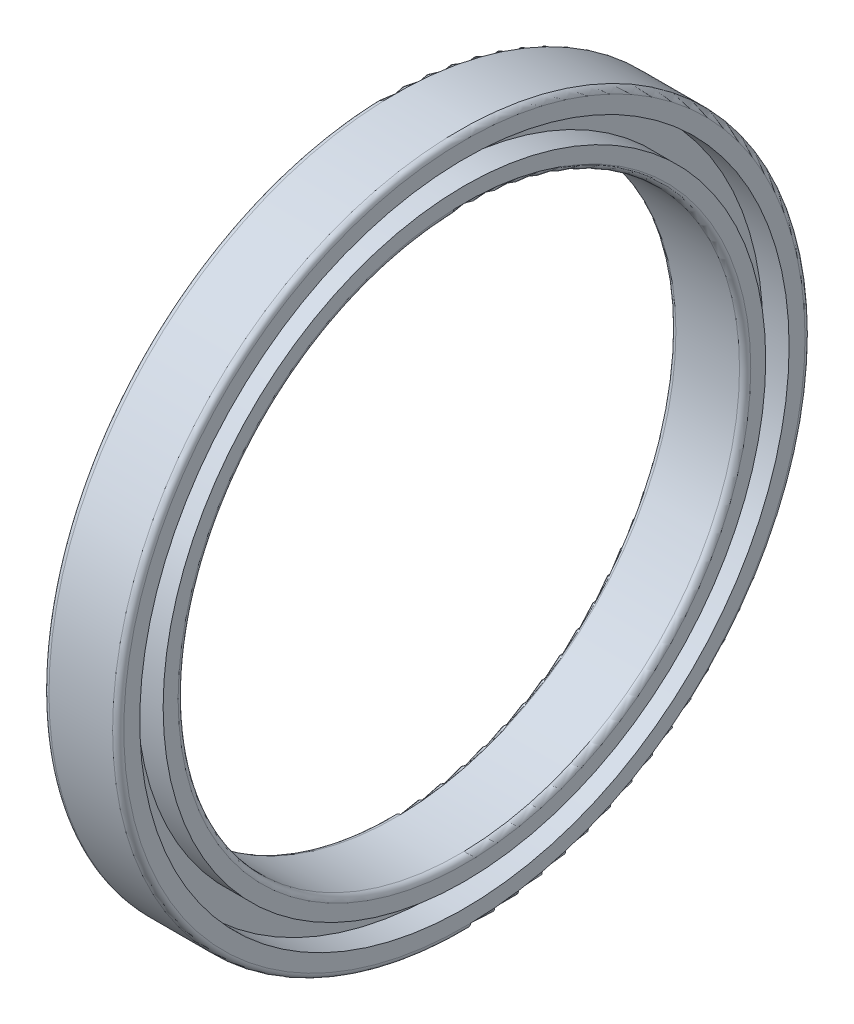
ISO-10303-21;
HEADER;
FILE_DESCRIPTION(('STEP AP214'),'2;1');
FILE_NAME('part.step','',(''),(''),'','','');
FILE_SCHEMA(('AUTOMOTIVE_DESIGN { 1 0 10303 214 1 1 1 1 }'));
ENDSEC;
DATA;
#1=APPLICATION_CONTEXT('core data for automotive mechanical design processes');
#2=APPLICATION_PROTOCOL_DEFINITION('international standard','automotive_design',2000,#1);
#3=PRODUCT_CONTEXT('',#1,'mechanical');
#4=PRODUCT('Part','Part','',(#3));
#5=PRODUCT_RELATED_PRODUCT_CATEGORY('part','',(#4));
#6=PRODUCT_DEFINITION_FORMATION('','',#4);
#7=PRODUCT_DEFINITION_CONTEXT('part definition',#1,'design');
#8=PRODUCT_DEFINITION('design','',#6,#7);
#9=PRODUCT_DEFINITION_SHAPE('','',#8);
#10=(LENGTH_UNIT() NAMED_UNIT(*) SI_UNIT(.MILLI.,.METRE.));
#11=(NAMED_UNIT(*) PLANE_ANGLE_UNIT() SI_UNIT($,.RADIAN.));
#12=(NAMED_UNIT(*) SI_UNIT($,.STERADIAN.) SOLID_ANGLE_UNIT());
#13=UNCERTAINTY_MEASURE_WITH_UNIT(LENGTH_MEASURE(1.E-05),#10,'distance_accuracy_value','');
#14=(GEOMETRIC_REPRESENTATION_CONTEXT(3) GLOBAL_UNCERTAINTY_ASSIGNED_CONTEXT((#13)) GLOBAL_UNIT_ASSIGNED_CONTEXT((#10,
#11,#12)) REPRESENTATION_CONTEXT('',''));
#15=CARTESIAN_POINT('',(0.,0.,0.));
#16=DIRECTION('',(0.,0.,1.));
#17=DIRECTION('',(1.,0.,0.));
#18=AXIS2_PLACEMENT_3D('',#15,#16,#17);
#19=CARTESIAN_POINT('',(-1.7,0.,0.));
#20=DIRECTION('',(1.,0.,0.));
#21=DIRECTION('',(0.,0.,-1.));
#22=AXIS2_PLACEMENT_3D('',#19,#20,#21);
#23=TOROIDAL_SURFACE('',#22,18.2,0.3);
#24=CARTESIAN_POINT('',(-2.,0.,0.));
#25=DIRECTION('',(1.,0.,0.));
#26=DIRECTION('',(0.,0.,-1.));
#27=AXIS2_PLACEMENT_3D('',#24,#25,#26);
#28=CIRCLE('',#27,18.2);
#29=CARTESIAN_POINT('',(-2.,0.,-18.2));
#30=VERTEX_POINT('',#29);
#31=EDGE_CURVE('E10',#30,#30,#28,.T.);
#32=ORIENTED_EDGE('',*,*,#31,.T.);
#33=EDGE_LOOP('',(#32));
#34=FACE_BOUND('',#33,.T.);
#35=CARTESIAN_POINT('',(-1.7,0.,0.));
#36=DIRECTION('',(1.,0.,0.));
#37=DIRECTION('',(0.,0.,-1.));
#38=AXIS2_PLACEMENT_3D('',#35,#36,#37);
#39=CIRCLE('',#38,18.5);
#40=CARTESIAN_POINT('',(-1.7,0.,-18.5));
#41=VERTEX_POINT('',#40);
#42=EDGE_CURVE('E266',#41,#41,#39,.T.);
#43=ORIENTED_EDGE('',*,*,#42,.F.);
#44=EDGE_LOOP('',(#43));
#45=FACE_BOUND('',#44,.T.);
#46=ADVANCED_FACE('F16',(#34,#45),#23,.T.);
#47=CARTESIAN_POINT('',(-2.,17.35,0.));
#48=DIRECTION('',(1.,0.,0.));
#49=DIRECTION('',(0.,1.,0.));
#50=AXIS2_PLACEMENT_3D('',#47,#48,#49);
#51=PLANE('',#50);
#52=CARTESIAN_POINT('',(-2.,0.,0.));
#53=DIRECTION('',(1.,0.,0.));
#54=DIRECTION('',(0.,0.,-1.));
#55=AXIS2_PLACEMENT_3D('',#52,#53,#54);
#56=CIRCLE('',#55,17.35);
#57=CARTESIAN_POINT('',(-2.,0.,-17.35));
#58=VERTEX_POINT('',#57);
#59=EDGE_CURVE('E24',#58,#58,#56,.T.);
#60=ORIENTED_EDGE('',*,*,#59,.T.);
#61=EDGE_LOOP('',(#60));
#62=FACE_BOUND('',#61,.T.);
#63=ORIENTED_EDGE('',*,*,#31,.F.);
#64=EDGE_LOOP('',(#63));
#65=FACE_BOUND('',#64,.T.);
#66=ADVANCED_FACE('F90',(#62,#65),#51,.F.);
#67=CARTESIAN_POINT('',(2.,0.,0.));
#68=DIRECTION('',(-1.,0.,0.));
#69=DIRECTION('',(0.,0.,-1.));
#70=AXIS2_PLACEMENT_3D('',#67,#68,#69);
#71=CYLINDRICAL_SURFACE('',#70,17.35);
#72=ORIENTED_EDGE('',*,*,#59,.F.);
#73=EDGE_LOOP('',(#72));
#74=FACE_BOUND('',#73,.T.);
#75=CARTESIAN_POINT('',(-0.6,0.,0.));
#76=DIRECTION('',(1.,0.,0.));
#77=DIRECTION('',(0.,0.,-1.));
#78=AXIS2_PLACEMENT_3D('',#75,#76,#77);
#79=CIRCLE('',#78,17.35);
#80=CARTESIAN_POINT('',(-0.6,0.,-17.35));
#81=VERTEX_POINT('',#80);
#82=EDGE_CURVE('E73',#81,#81,#79,.T.);
#83=ORIENTED_EDGE('',*,*,#82,.T.);
#84=EDGE_LOOP('',(#83));
#85=FACE_BOUND('',#84,.T.);
#86=ADVANCED_FACE('F95',(#74,#85),#71,.F.);
#87=CARTESIAN_POINT('',(-0.6,16.1,0.));
#88=DIRECTION('',(1.,0.,0.));
#89=DIRECTION('',(0.,1.,0.));
#90=AXIS2_PLACEMENT_3D('',#87,#88,#89);
#91=PLANE('',#90);
#92=CARTESIAN_POINT('',(-0.6,0.,0.));
#93=DIRECTION('',(1.,0.,0.));
#94=DIRECTION('',(0.,0.,-1.));
#95=AXIS2_PLACEMENT_3D('',#92,#93,#94);
#96=CIRCLE('',#95,16.1);
#97=CARTESIAN_POINT('',(-0.6,0.,-16.1));
#98=VERTEX_POINT('',#97);
#99=EDGE_CURVE('E80',#98,#98,#96,.T.);
#100=ORIENTED_EDGE('',*,*,#99,.T.);
#101=EDGE_LOOP('',(#100));
#102=FACE_BOUND('',#101,.T.);
#103=ORIENTED_EDGE('',*,*,#82,.F.);
#104=EDGE_LOOP('',(#103));
#105=FACE_BOUND('',#104,.T.);
#106=ADVANCED_FACE('F188',(#102,#105),#91,.F.);
#107=CARTESIAN_POINT('',(1.7,0.,0.));
#108=DIRECTION('',(1.,0.,0.));
#109=DIRECTION('',(0.,0.,-1.));
#110=AXIS2_PLACEMENT_3D('',#107,#108,#109);
#111=TOROIDAL_SURFACE('',#110,15.3,0.3);
#112=CARTESIAN_POINT('',(2.,0.,0.));
#113=DIRECTION('',(1.,0.,0.));
#114=DIRECTION('',(0.,0.,-1.));
#115=AXIS2_PLACEMENT_3D('',#112,#113,#114);
#116=CIRCLE('',#115,15.3);
#117=CARTESIAN_POINT('',(2.,0.,-15.3));
#118=VERTEX_POINT('',#117);
#119=EDGE_CURVE('E291',#118,#118,#116,.T.);
#120=ORIENTED_EDGE('',*,*,#119,.T.);
#121=EDGE_LOOP('',(#120));
#122=FACE_BOUND('',#121,.T.);
#123=CARTESIAN_POINT('',(1.7,0.,0.));
#124=DIRECTION('',(1.,0.,0.));
#125=DIRECTION('',(0.,0.,-1.));
#126=AXIS2_PLACEMENT_3D('',#123,#124,#125);
#127=CIRCLE('',#126,15.);
#128=CARTESIAN_POINT('',(1.7,0.,-15.));
#129=VERTEX_POINT('',#128);
#130=EDGE_CURVE('E68',#129,#129,#127,.T.);
#131=ORIENTED_EDGE('',*,*,#130,.F.);
#132=EDGE_LOOP('',(#131));
#133=FACE_BOUND('',#132,.T.);
#134=ADVANCED_FACE('F202',(#122,#133),#111,.T.);
#135=CARTESIAN_POINT('',(50.,0.,0.));
#136=DIRECTION('',(-1.,0.,0.));
#137=DIRECTION('',(0.,0.,-1.));
#138=AXIS2_PLACEMENT_3D('',#135,#136,#137);
#139=CYLINDRICAL_SURFACE('',#138,15.);
#140=ORIENTED_EDGE('',*,*,#130,.T.);
#141=EDGE_LOOP('',(#140));
#142=FACE_BOUND('',#141,.T.);
#143=CARTESIAN_POINT('',(-1.7,0.,0.));
#144=DIRECTION('',(1.,0.,0.));
#145=DIRECTION('',(0.,0.,-1.));
#146=AXIS2_PLACEMENT_3D('',#143,#144,#145);
#147=CIRCLE('',#146,15.);
#148=CARTESIAN_POINT('',(-1.7,0.,-15.));
#149=VERTEX_POINT('',#148);
#150=EDGE_CURVE('E74',#149,#149,#147,.T.);
#151=ORIENTED_EDGE('',*,*,#150,.F.);
#152=EDGE_LOOP('',(#151));
#153=FACE_BOUND('',#152,.T.);
#154=ADVANCED_FACE('F69',(#142,#153),#139,.F.);
#155=CARTESIAN_POINT('',(-1.7,0.,0.));
#156=DIRECTION('',(1.,0.,0.));
#157=DIRECTION('',(0.,0.,-1.));
#158=AXIS2_PLACEMENT_3D('',#155,#156,#157);
#159=TOROIDAL_SURFACE('',#158,15.3,0.3);
#160=ORIENTED_EDGE('',*,*,#150,.T.);
#161=EDGE_LOOP('',(#160));
#162=FACE_BOUND('',#161,.T.);
#163=CARTESIAN_POINT('',(-2.,0.,0.));
#164=DIRECTION('',(1.,0.,0.));
#165=DIRECTION('',(0.,0.,-1.));
#166=AXIS2_PLACEMENT_3D('',#163,#164,#165);
#167=CIRCLE('',#166,15.3);
#168=CARTESIAN_POINT('',(-2.,0.,-15.3));
#169=VERTEX_POINT('',#168);
#170=EDGE_CURVE('E275',#169,#169,#167,.T.);
#171=ORIENTED_EDGE('',*,*,#170,.F.);
#172=EDGE_LOOP('',(#171));
#173=FACE_BOUND('',#172,.T.);
#174=ADVANCED_FACE('F179',(#162,#173),#159,.T.);
#175=CARTESIAN_POINT('',(2.,0.,0.));
#176=DIRECTION('',(-1.,0.,0.));
#177=DIRECTION('',(0.,0.,-1.));
#178=AXIS2_PLACEMENT_3D('',#175,#176,#177);
#179=CYLINDRICAL_SURFACE('',#178,16.1);
#180=ORIENTED_EDGE('',*,*,#99,.F.);
#181=EDGE_LOOP('',(#180));
#182=FACE_BOUND('',#181,.T.);
#183=CARTESIAN_POINT('',(-2.,0.,0.));
#184=DIRECTION('',(1.,0.,0.));
#185=DIRECTION('',(0.,0.,-1.));
#186=AXIS2_PLACEMENT_3D('',#183,#184,#185);
#187=CIRCLE('',#186,16.1);
#188=CARTESIAN_POINT('',(-2.,0.,-16.1));
#189=VERTEX_POINT('',#188);
#190=EDGE_CURVE('E269',#189,#189,#187,.T.);
#191=ORIENTED_EDGE('',*,*,#190,.T.);
#192=EDGE_LOOP('',(#191));
#193=FACE_BOUND('',#192,.T.);
#194=ADVANCED_FACE('F170',(#182,#193),#179,.T.);
#195=CARTESIAN_POINT('',(-2.,0.,0.));
#196=DIRECTION('',(1.,0.,0.));
#197=DIRECTION('',(0.,1.,0.));
#198=AXIS2_PLACEMENT_3D('',#195,#196,#197);
#199=PLANE('',#198);
#200=ORIENTED_EDGE('',*,*,#170,.T.);
#201=EDGE_LOOP('',(#200));
#202=FACE_BOUND('',#201,.T.);
#203=ORIENTED_EDGE('',*,*,#190,.F.);
#204=EDGE_LOOP('',(#203));
#205=FACE_BOUND('',#204,.T.);
#206=ADVANCED_FACE('F161',(#202,#205),#199,.F.);
#207=CARTESIAN_POINT('',(2.,0.,0.));
#208=DIRECTION('',(-1.,0.,0.));
#209=DIRECTION('',(0.,0.,-1.));
#210=AXIS2_PLACEMENT_3D('',#207,#208,#209);
#211=CYLINDRICAL_SURFACE('',#210,18.5);
#212=CARTESIAN_POINT('',(1.7,0.,0.));
#213=DIRECTION('',(1.,0.,0.));
#214=DIRECTION('',(0.,0.,-1.));
#215=AXIS2_PLACEMENT_3D('',#212,#213,#214);
#216=CIRCLE('',#215,18.5);
#217=CARTESIAN_POINT('',(1.7,0.,-18.5));
#218=VERTEX_POINT('',#217);
#219=EDGE_CURVE('E270',#218,#218,#216,.T.);
#220=ORIENTED_EDGE('',*,*,#219,.F.);
#221=EDGE_LOOP('',(#220));
#222=FACE_BOUND('',#221,.T.);
#223=ORIENTED_EDGE('',*,*,#42,.T.);
#224=EDGE_LOOP('',(#223));
#225=FACE_BOUND('',#224,.T.);
#226=ADVANCED_FACE('F152',(#222,#225),#211,.T.);
#227=CARTESIAN_POINT('',(1.7,0.,0.));
#228=DIRECTION('',(1.,0.,0.));
#229=DIRECTION('',(0.,0.,-1.));
#230=AXIS2_PLACEMENT_3D('',#227,#228,#229);
#231=TOROIDAL_SURFACE('',#230,18.2,0.3);
#232=ORIENTED_EDGE('',*,*,#219,.T.);
#233=EDGE_LOOP('',(#232));
#234=FACE_BOUND('',#233,.T.);
#235=CARTESIAN_POINT('',(2.,0.,0.));
#236=DIRECTION('',(1.,0.,0.));
#237=DIRECTION('',(0.,0.,-1.));
#238=AXIS2_PLACEMENT_3D('',#235,#236,#237);
#239=CIRCLE('',#238,18.2);
#240=CARTESIAN_POINT('',(2.,0.,-18.2));
#241=VERTEX_POINT('',#240);
#242=EDGE_CURVE('E277',#241,#241,#239,.T.);
#243=ORIENTED_EDGE('',*,*,#242,.F.);
#244=EDGE_LOOP('',(#243));
#245=FACE_BOUND('',#244,.T.);
#246=ADVANCED_FACE('F136',(#234,#245),#231,.T.);
#247=CARTESIAN_POINT('',(2.,18.2,0.));
#248=DIRECTION('',(-1.,0.,0.));
#249=DIRECTION('',(0.,0.,1.));
#250=AXIS2_PLACEMENT_3D('',#247,#248,#249);
#251=PLANE('',#250);
#252=CARTESIAN_POINT('',(2.,0.,0.));
#253=DIRECTION('',(1.,0.,0.));
#254=DIRECTION('',(0.,0.,-1.));
#255=AXIS2_PLACEMENT_3D('',#252,#253,#254);
#256=CIRCLE('',#255,17.35);
#257=CARTESIAN_POINT('',(2.,0.,-17.35));
#258=VERTEX_POINT('',#257);
#259=EDGE_CURVE('E294',#258,#258,#256,.T.);
#260=ORIENTED_EDGE('',*,*,#259,.F.);
#261=EDGE_LOOP('',(#260));
#262=FACE_BOUND('',#261,.T.);
#263=ORIENTED_EDGE('',*,*,#242,.T.);
#264=EDGE_LOOP('',(#263));
#265=FACE_BOUND('',#264,.T.);
#266=ADVANCED_FACE('F131',(#262,#265),#251,.F.);
#267=CARTESIAN_POINT('',(2.,0.,0.));
#268=DIRECTION('',(-1.,0.,0.));
#269=DIRECTION('',(0.,0.,-1.));
#270=AXIS2_PLACEMENT_3D('',#267,#268,#269);
#271=CYLINDRICAL_SURFACE('',#270,17.35);
#272=CARTESIAN_POINT('',(0.6,0.,0.));
#273=DIRECTION('',(1.,0.,0.));
#274=DIRECTION('',(0.,0.,-1.));
#275=AXIS2_PLACEMENT_3D('',#272,#273,#274);
#276=CIRCLE('',#275,17.35);
#277=CARTESIAN_POINT('',(0.6,0.,-17.35));
#278=VERTEX_POINT('',#277);
#279=EDGE_CURVE('E295',#278,#278,#276,.T.);
#280=ORIENTED_EDGE('',*,*,#279,.F.);
#281=EDGE_LOOP('',(#280));
#282=FACE_BOUND('',#281,.T.);
#283=ORIENTED_EDGE('',*,*,#259,.T.);
#284=EDGE_LOOP('',(#283));
#285=FACE_BOUND('',#284,.T.);
#286=ADVANCED_FACE('F125',(#282,#285),#271,.F.);
#287=CARTESIAN_POINT('',(0.6,17.35,0.));
#288=DIRECTION('',(-1.,0.,0.));
#289=DIRECTION('',(0.,0.,1.));
#290=AXIS2_PLACEMENT_3D('',#287,#288,#289);
#291=PLANE('',#290);
#292=CARTESIAN_POINT('',(0.6,0.,0.));
#293=DIRECTION('',(1.,0.,0.));
#294=DIRECTION('',(0.,0.,-1.));
#295=AXIS2_PLACEMENT_3D('',#292,#293,#294);
#296=CIRCLE('',#295,16.1);
#297=CARTESIAN_POINT('',(0.6,0.,-16.1));
#298=VERTEX_POINT('',#297);
#299=EDGE_CURVE('E297',#298,#298,#296,.T.);
#300=ORIENTED_EDGE('',*,*,#299,.F.);
#301=EDGE_LOOP('',(#300));
#302=FACE_BOUND('',#301,.T.);
#303=ORIENTED_EDGE('',*,*,#279,.T.);
#304=EDGE_LOOP('',(#303));
#305=FACE_BOUND('',#304,.T.);
#306=ADVANCED_FACE('F116',(#302,#305),#291,.F.);
#307=CARTESIAN_POINT('',(2.,0.,0.));
#308=DIRECTION('',(-1.,0.,0.));
#309=DIRECTION('',(0.,0.,-1.));
#310=AXIS2_PLACEMENT_3D('',#307,#308,#309);
#311=CYLINDRICAL_SURFACE('',#310,16.1);
#312=CARTESIAN_POINT('',(2.,0.,0.));
#313=DIRECTION('',(1.,0.,0.));
#314=DIRECTION('',(0.,0.,-1.));
#315=AXIS2_PLACEMENT_3D('',#312,#313,#314);
#316=CIRCLE('',#315,16.1);
#317=CARTESIAN_POINT('',(2.,0.,-16.1));
#318=VERTEX_POINT('',#317);
#319=EDGE_CURVE('E316',#318,#318,#316,.T.);
#320=ORIENTED_EDGE('',*,*,#319,.F.);
#321=EDGE_LOOP('',(#320));
#322=FACE_BOUND('',#321,.T.);
#323=ORIENTED_EDGE('',*,*,#299,.T.);
#324=EDGE_LOOP('',(#323));
#325=FACE_BOUND('',#324,.T.);
#326=ADVANCED_FACE('F107',(#322,#325),#311,.T.);
#327=CARTESIAN_POINT('',(2.,16.1,0.));
#328=DIRECTION('',(-1.,0.,0.));
#329=DIRECTION('',(0.,0.,1.));
#330=AXIS2_PLACEMENT_3D('',#327,#328,#329);
#331=PLANE('',#330);
#332=ORIENTED_EDGE('',*,*,#119,.F.);
#333=EDGE_LOOP('',(#332));
#334=FACE_BOUND('',#333,.T.);
#335=ORIENTED_EDGE('',*,*,#319,.T.);
#336=EDGE_LOOP('',(#335));
#337=FACE_BOUND('',#336,.T.);
#338=ADVANCED_FACE('F102',(#334,#337),#331,.F.);
#339=CLOSED_SHELL('',(#46,#66,#86,#106,#134,#154,#174,#194,#206,#226,#246,#266,#286,#306,#326,#338));
#340=MANIFOLD_SOLID_BREP('B1',#339);
#341=ADVANCED_BREP_SHAPE_REPRESENTATION('',(#18,#340),#14);
#342=SHAPE_DEFINITION_REPRESENTATION(#9,#341);
ENDSEC;
END-ISO-10303-21;
